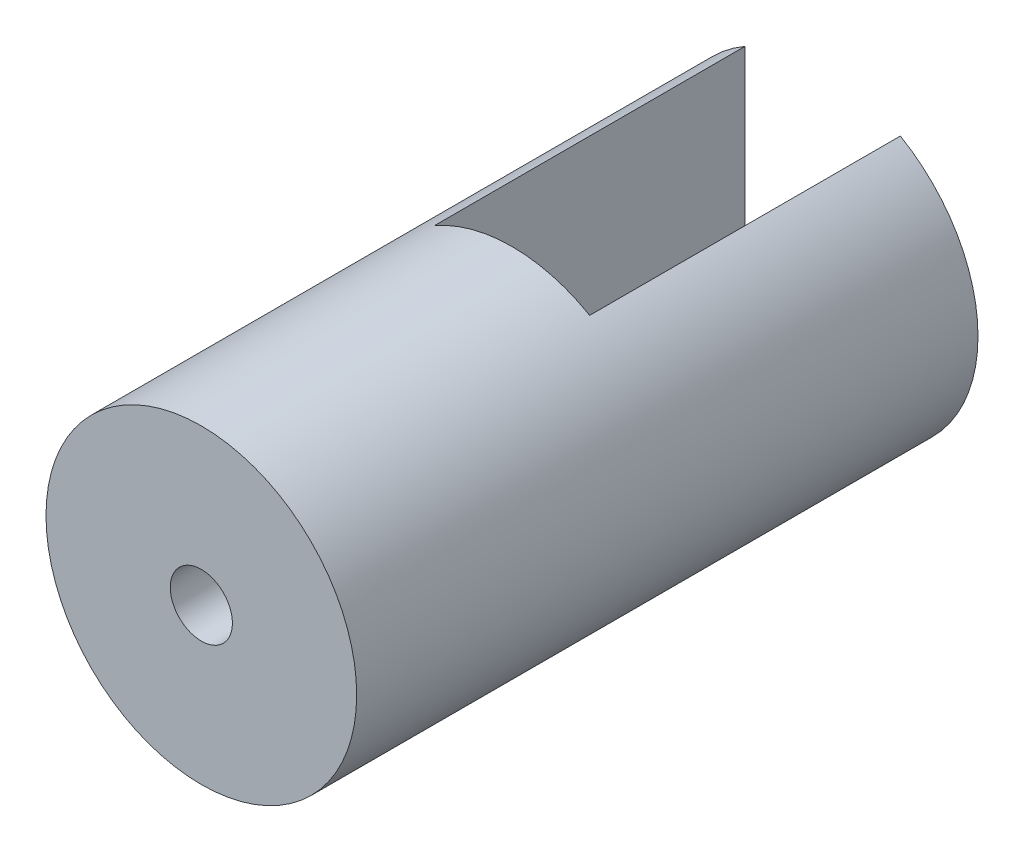
ISO-10303-21;
HEADER;
FILE_DESCRIPTION(('STEP AP214'),'2;1');
FILE_NAME('part.step','',(''),(''),'','','');
FILE_SCHEMA(('AUTOMOTIVE_DESIGN { 1 0 10303 214 1 1 1 1 }'));
ENDSEC;
DATA;
#1=APPLICATION_CONTEXT('core data for automotive mechanical design processes');
#2=APPLICATION_PROTOCOL_DEFINITION('international standard','automotive_design',2000,#1);
#3=PRODUCT_CONTEXT('',#1,'mechanical');
#4=PRODUCT('Part','Part','',(#3));
#5=PRODUCT_RELATED_PRODUCT_CATEGORY('part','',(#4));
#6=PRODUCT_DEFINITION_FORMATION('','',#4);
#7=PRODUCT_DEFINITION_CONTEXT('part definition',#1,'design');
#8=PRODUCT_DEFINITION('design','',#6,#7);
#9=PRODUCT_DEFINITION_SHAPE('','',#8);
#10=(LENGTH_UNIT() NAMED_UNIT(*) SI_UNIT(.MILLI.,.METRE.));
#11=(NAMED_UNIT(*) PLANE_ANGLE_UNIT() SI_UNIT($,.RADIAN.));
#12=(NAMED_UNIT(*) SI_UNIT($,.STERADIAN.) SOLID_ANGLE_UNIT());
#13=UNCERTAINTY_MEASURE_WITH_UNIT(LENGTH_MEASURE(1.E-05),#10,'distance_accuracy_value','');
#14=(GEOMETRIC_REPRESENTATION_CONTEXT(3) GLOBAL_UNCERTAINTY_ASSIGNED_CONTEXT((#13)) GLOBAL_UNIT_ASSIGNED_CONTEXT((#10,
#11,#12)) REPRESENTATION_CONTEXT('',''));
#15=CARTESIAN_POINT('',(0.,0.,0.));
#16=DIRECTION('',(0.,0.,1.));
#17=DIRECTION('',(1.,0.,0.));
#18=AXIS2_PLACEMENT_3D('',#15,#16,#17);
#19=CARTESIAN_POINT('',(0.,0.,0.));
#20=DIRECTION('',(0.,0.,1.));
#21=DIRECTION('',(1.,0.,0.));
#22=AXIS2_PLACEMENT_3D('',#19,#20,#21);
#23=PLANE('',#22);
#24=CARTESIAN_POINT('',(0.,0.,0.));
#25=DIRECTION('',(0.,0.,1.));
#26=DIRECTION('',(1.,0.,0.));
#27=AXIS2_PLACEMENT_3D('',#24,#25,#26);
#28=CIRCLE('',#27,5.);
#29=CARTESIAN_POINT('',(2.5,-4.33012701892219,0.));
#30=VERTEX_POINT('',#29);
#31=CARTESIAN_POINT('',(2.5,4.33012701892219,0.));
#32=VERTEX_POINT('',#31);
#33=EDGE_CURVE('E96',#30,#32,#28,.T.);
#34=ORIENTED_EDGE('',*,*,#33,.F.);
#35=DIRECTION('',(0.,1.,0.));
#36=VECTOR('',#35,1.);
#37=CARTESIAN_POINT('',(2.5,0.,0.));
#38=LINE('',#37,#36);
#39=EDGE_CURVE('E85',#30,#32,#38,.T.);
#40=ORIENTED_EDGE('',*,*,#39,.T.);
#41=EDGE_LOOP('',(#34,#40));
#42=FACE_BOUND('',#41,.T.);
#43=ADVANCED_FACE('F37',(#42),#23,.F.);
#44=CARTESIAN_POINT('',(0.,0.,20.));
#45=DIRECTION('',(0.,0.,-1.));
#46=DIRECTION('',(-1.,0.,0.));
#47=AXIS2_PLACEMENT_3D('',#44,#45,#46);
#48=CYLINDRICAL_SURFACE('',#47,5.);
#49=ORIENTED_EDGE('',*,*,#33,.T.);
#50=DIRECTION('',(0.,0.,-1.));
#51=VECTOR('',#50,1.);
#52=CARTESIAN_POINT('',(2.5,4.33012701892219,20.));
#53=LINE('',#52,#51);
#54=CARTESIAN_POINT('',(2.5,4.33012701892219,10.));
#55=VERTEX_POINT('',#54);
#56=EDGE_CURVE('E93',#32,#55,#53,.F.);
#57=ORIENTED_EDGE('',*,*,#56,.T.);
#58=CARTESIAN_POINT('',(0.,0.,10.));
#59=DIRECTION('',(0.,0.,1.));
#60=DIRECTION('',(1.,0.,0.));
#61=AXIS2_PLACEMENT_3D('',#58,#59,#60);
#62=CIRCLE('',#61,5.);
#63=CARTESIAN_POINT('',(-2.5,4.33012701892219,10.));
#64=VERTEX_POINT('',#63);
#65=EDGE_CURVE('E11',#55,#64,#62,.T.);
#66=ORIENTED_EDGE('',*,*,#65,.T.);
#67=DIRECTION('',(0.,0.,-1.));
#68=VECTOR('',#67,1.);
#69=CARTESIAN_POINT('',(-2.5,4.33012701892219,20.));
#70=LINE('',#69,#68);
#71=CARTESIAN_POINT('',(-2.5,4.33012701892219,0.));
#72=VERTEX_POINT('',#71);
#73=EDGE_CURVE('E80',#64,#72,#70,.T.);
#74=ORIENTED_EDGE('',*,*,#73,.T.);
#75=CARTESIAN_POINT('',(-2.5,-4.33012701892219,0.));
#76=VERTEX_POINT('',#75);
#77=EDGE_CURVE('E91',#72,#76,#28,.T.);
#78=ORIENTED_EDGE('',*,*,#77,.T.);
#79=DIRECTION('',(0.,0.,-1.));
#80=VECTOR('',#79,1.);
#81=CARTESIAN_POINT('',(-2.5,-4.33012701892219,20.));
#82=LINE('',#81,#80);
#83=CARTESIAN_POINT('',(-2.5,-4.33012701892219,10.));
#84=VERTEX_POINT('',#83);
#85=EDGE_CURVE('E52',#76,#84,#82,.F.);
#86=ORIENTED_EDGE('',*,*,#85,.T.);
#87=CARTESIAN_POINT('',(2.5,-4.33012701892219,10.));
#88=VERTEX_POINT('',#87);
#89=EDGE_CURVE('E41',#84,#88,#62,.T.);
#90=ORIENTED_EDGE('',*,*,#89,.T.);
#91=DIRECTION('',(0.,0.,-1.));
#92=VECTOR('',#91,1.);
#93=CARTESIAN_POINT('',(2.5,-4.33012701892219,20.));
#94=LINE('',#93,#92);
#95=EDGE_CURVE('E60',#88,#30,#94,.T.);
#96=ORIENTED_EDGE('',*,*,#95,.T.);
#97=EDGE_LOOP('',(#49,#57,#66,#74,#78,#86,#90,#96));
#98=FACE_BOUND('',#97,.T.);
#99=CARTESIAN_POINT('',(0.,0.,20.));
#100=DIRECTION('',(0.,0.,1.));
#101=DIRECTION('',(1.,0.,0.));
#102=AXIS2_PLACEMENT_3D('',#99,#100,#101);
#103=CIRCLE('',#102,5.);
#104=CARTESIAN_POINT('',(5.,0.,20.));
#105=VERTEX_POINT('',#104);
#106=EDGE_CURVE('E86',#105,#105,#103,.T.);
#107=ORIENTED_EDGE('',*,*,#106,.F.);
#108=EDGE_LOOP('',(#107));
#109=FACE_BOUND('',#108,.T.);
#110=ADVANCED_FACE('F39',(#98,#109),#48,.T.);
#111=CARTESIAN_POINT('',(0.,0.,20.));
#112=DIRECTION('',(0.,0.,1.));
#113=DIRECTION('',(1.,0.,0.));
#114=AXIS2_PLACEMENT_3D('',#111,#112,#113);
#115=PLANE('',#114);
#116=CARTESIAN_POINT('',(0.,0.,20.));
#117=DIRECTION('',(0.,0.,-1.));
#118=DIRECTION('',(-1.,0.,0.));
#119=AXIS2_PLACEMENT_3D('',#116,#117,#118);
#120=CIRCLE('',#119,1.);
#121=CARTESIAN_POINT('',(-1.,0.,20.));
#122=VERTEX_POINT('',#121);
#123=EDGE_CURVE('E111',#122,#122,#120,.T.);
#124=ORIENTED_EDGE('',*,*,#123,.T.);
#125=EDGE_LOOP('',(#124));
#126=FACE_BOUND('',#125,.T.);
#127=ORIENTED_EDGE('',*,*,#106,.T.);
#128=EDGE_LOOP('',(#127));
#129=FACE_BOUND('',#128,.T.);
#130=ADVANCED_FACE('F132',(#126,#129),#115,.T.);
#131=ORIENTED_EDGE('',*,*,#77,.F.);
#132=DIRECTION('',(0.,-1.,0.));
#133=VECTOR('',#132,1.);
#134=CARTESIAN_POINT('',(-2.5,0.,0.));
#135=LINE('',#134,#133);
#136=EDGE_CURVE('E77',#72,#76,#135,.T.);
#137=ORIENTED_EDGE('',*,*,#136,.T.);
#138=EDGE_LOOP('',(#131,#137));
#139=FACE_BOUND('',#138,.T.);
#140=ADVANCED_FACE('F95',(#139),#23,.F.);
#141=CARTESIAN_POINT('',(0.,0.,10.));
#142=DIRECTION('',(0.,0.,1.));
#143=DIRECTION('',(1.,0.,0.));
#144=AXIS2_PLACEMENT_3D('',#141,#142,#143);
#145=PLANE('',#144);
#146=CARTESIAN_POINT('',(0.,0.,10.));
#147=DIRECTION('',(0.,0.,-1.));
#148=DIRECTION('',(-1.,0.,0.));
#149=AXIS2_PLACEMENT_3D('',#146,#147,#148);
#150=CIRCLE('',#149,1.);
#151=CARTESIAN_POINT('',(-1.,0.,10.));
#152=VERTEX_POINT('',#151);
#153=EDGE_CURVE('E144',#152,#152,#150,.T.);
#154=ORIENTED_EDGE('',*,*,#153,.F.);
#155=EDGE_LOOP('',(#154));
#156=FACE_BOUND('',#155,.T.);
#157=DIRECTION('',(0.,-1.,0.));
#158=VECTOR('',#157,1.);
#159=CARTESIAN_POINT('',(2.5,-5.,10.));
#160=LINE('',#159,#158);
#161=EDGE_CURVE('E108',#55,#88,#160,.T.);
#162=ORIENTED_EDGE('',*,*,#161,.T.);
#163=ORIENTED_EDGE('',*,*,#89,.F.);
#164=DIRECTION('',(0.,1.,0.));
#165=VECTOR('',#164,1.);
#166=CARTESIAN_POINT('',(-2.5,5.,10.));
#167=LINE('',#166,#165);
#168=EDGE_CURVE('E107',#84,#64,#167,.T.);
#169=ORIENTED_EDGE('',*,*,#168,.T.);
#170=ORIENTED_EDGE('',*,*,#65,.F.);
#171=EDGE_LOOP('',(#162,#163,#169,#170));
#172=FACE_BOUND('',#171,.T.);
#173=ADVANCED_FACE('F106',(#156,#172),#145,.F.);
#174=CARTESIAN_POINT('',(2.5,-5.,10.));
#175=DIRECTION('',(1.,0.,0.));
#176=DIRECTION('',(0.,0.,-1.));
#177=AXIS2_PLACEMENT_3D('',#174,#175,#176);
#178=PLANE('',#177);
#179=ORIENTED_EDGE('',*,*,#161,.F.);
#180=ORIENTED_EDGE('',*,*,#56,.F.);
#181=ORIENTED_EDGE('',*,*,#39,.F.);
#182=ORIENTED_EDGE('',*,*,#95,.F.);
#183=EDGE_LOOP('',(#179,#180,#181,#182));
#184=FACE_BOUND('',#183,.T.);
#185=ADVANCED_FACE('F115',(#184),#178,.F.);
#186=CARTESIAN_POINT('',(-2.5,5.,10.));
#187=DIRECTION('',(-1.,0.,0.));
#188=DIRECTION('',(0.,0.,1.));
#189=AXIS2_PLACEMENT_3D('',#186,#187,#188);
#190=PLANE('',#189);
#191=ORIENTED_EDGE('',*,*,#168,.F.);
#192=ORIENTED_EDGE('',*,*,#85,.F.);
#193=ORIENTED_EDGE('',*,*,#136,.F.);
#194=ORIENTED_EDGE('',*,*,#73,.F.);
#195=EDGE_LOOP('',(#191,#192,#193,#194));
#196=FACE_BOUND('',#195,.T.);
#197=ADVANCED_FACE('F79',(#196),#190,.F.);
#198=CARTESIAN_POINT('',(0.,0.,20.));
#199=DIRECTION('',(0.,0.,-1.));
#200=DIRECTION('',(-1.,0.,0.));
#201=AXIS2_PLACEMENT_3D('',#198,#199,#200);
#202=CYLINDRICAL_SURFACE('',#201,1.);
#203=ORIENTED_EDGE('',*,*,#123,.F.);
#204=EDGE_LOOP('',(#203));
#205=FACE_BOUND('',#204,.T.);
#206=ORIENTED_EDGE('',*,*,#153,.T.);
#207=EDGE_LOOP('',(#206));
#208=FACE_BOUND('',#207,.T.);
#209=ADVANCED_FACE('F122',(#205,#208),#202,.F.);
#210=CLOSED_SHELL('',(#43,#110,#130,#140,#173,#185,#197,#209));
#211=MANIFOLD_SOLID_BREP('B2',#210);
#212=ADVANCED_BREP_SHAPE_REPRESENTATION('',(#18,#211),#14);
#213=SHAPE_DEFINITION_REPRESENTATION(#9,#212);
ENDSEC;
END-ISO-10303-21;
